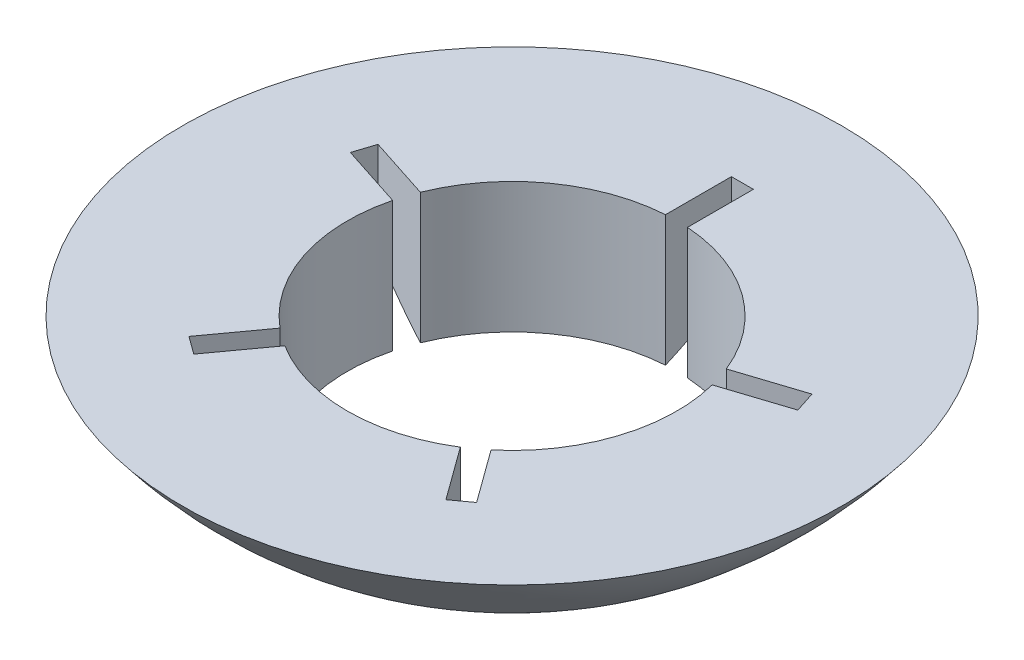
ISO-10303-21;
HEADER;
FILE_DESCRIPTION(('STEP AP214'),'2;1');
FILE_NAME('part.step','',(''),(''),'','','');
FILE_SCHEMA(('AUTOMOTIVE_DESIGN { 1 0 10303 214 1 1 1 1 }'));
ENDSEC;
DATA;
#1=APPLICATION_CONTEXT('core data for automotive mechanical design processes');
#2=APPLICATION_PROTOCOL_DEFINITION('international standard','automotive_design',2000,#1);
#3=PRODUCT_CONTEXT('',#1,'mechanical');
#4=PRODUCT('Part','Part','',(#3));
#5=PRODUCT_RELATED_PRODUCT_CATEGORY('part','',(#4));
#6=PRODUCT_DEFINITION_FORMATION('','',#4);
#7=PRODUCT_DEFINITION_CONTEXT('part definition',#1,'design');
#8=PRODUCT_DEFINITION('design','',#6,#7);
#9=PRODUCT_DEFINITION_SHAPE('','',#8);
#10=(LENGTH_UNIT() NAMED_UNIT(*) SI_UNIT(.MILLI.,.METRE.));
#11=(NAMED_UNIT(*) PLANE_ANGLE_UNIT() SI_UNIT($,.RADIAN.));
#12=(NAMED_UNIT(*) SI_UNIT($,.STERADIAN.) SOLID_ANGLE_UNIT());
#13=UNCERTAINTY_MEASURE_WITH_UNIT(LENGTH_MEASURE(1.E-05),#10,'distance_accuracy_value','');
#14=(GEOMETRIC_REPRESENTATION_CONTEXT(3) GLOBAL_UNCERTAINTY_ASSIGNED_CONTEXT((#13)) GLOBAL_UNIT_ASSIGNED_CONTEXT((#10,
#11,#12)) REPRESENTATION_CONTEXT('',''));
#15=CARTESIAN_POINT('',(0.,0.,0.));
#16=DIRECTION('',(0.,0.,1.));
#17=DIRECTION('',(1.,0.,0.));
#18=AXIS2_PLACEMENT_3D('',#15,#16,#17);
#19=CARTESIAN_POINT('',(0.,2.2498309057561,0.));
#20=DIRECTION('',(0.,-1.,0.));
#21=DIRECTION('',(0.,0.,-1.));
#22=AXIS2_PLACEMENT_3D('',#19,#20,#21);
#23=DEGENERATE_TOROIDAL_SURFACE('',#22,8.45471219482457E-05,3.74983090670924,.T.);
#24=CARTESIAN_POINT('',(0.,0.,0.));
#25=DIRECTION('',(0.,-1.,0.));
#26=DIRECTION('',(0.,0.,-1.));
#27=AXIS2_PLACEMENT_3D('',#24,#25,#26);
#28=CIRCLE('',#27,3.);
#29=CARTESIAN_POINT('',(0.,0.,-3.));
#30=VERTEX_POINT('',#29);
#31=EDGE_CURVE('E12',#30,#30,#28,.T.);
#32=ORIENTED_EDGE('',*,*,#31,.T.);
#33=EDGE_LOOP('',(#32));
#34=FACE_BOUND('',#33,.T.);
#35=CARTESIAN_POINT('',(1.30957287672877,-0.861991089667224,1.6319216845088));
#36=CARTESIAN_POINT('',(1.28253897691627,-0.863067253594937,1.65156296242041));
#37=CARTESIAN_POINT('',(1.25550507710377,-0.863605335558811,1.67120424033203));
#38=CARTESIAN_POINT('',(1.20143727747877,-0.863605335558885,1.71048679615526));
#39=CARTESIAN_POINT('',(1.17440337766627,-0.863067253595084,1.73012807406688));
#40=CARTESIAN_POINT('',(1.14736947785377,-0.861991089667446,1.74976935197849));
#41=B_SPLINE_CURVE_WITH_KNOTS('',3,(#35,#36,#37,#38,#39,#40),.UNSPECIFIED.,.F.,.F.,(4,2,4),(0.,
0.100260209572197,0.200520419144391),.UNSPECIFIED.);
#42=CARTESIAN_POINT('',(1.30937287672876,-0.861999043491411,1.6320669930144));
#43=VERTEX_POINT('',#42);
#44=CARTESIAN_POINT('',(1.14756947785377,-0.861999043492123,1.74962404347289));
#45=VERTEX_POINT('',#44);
#46=EDGE_CURVE('E753',#43,#45,#41,.T.);
#47=ORIENTED_EDGE('',*,*,#46,.F.);
#48=CARTESIAN_POINT('',(0.960472803362657,-1.18706090970247,1.15184723998223));
#49=CARTESIAN_POINT('',(1.02153028702982,-1.14181278266513,1.23588565661118));
#50=CARTESIAN_POINT('',(1.0811461440183,-1.09208639331853,1.31793984434351));
#51=CARTESIAN_POINT('',(1.19749460464242,-0.983677090002554,1.47807976202121));
#52=CARTESIAN_POINT('',(1.25422720827785,-0.924994176032481,1.55616549196627));
#53=CARTESIAN_POINT('',(1.30951818523436,-0.861832999752439,1.6322669930144));
#54=B_SPLINE_CURVE_WITH_KNOTS('',3,(#48,#49,#50,#51,#52,#53),.UNSPECIFIED.,.F.,.F.,(4,2,4),(0.,
0.338875914365437,0.6777518287573),.UNSPECIFIED.);
#55=CARTESIAN_POINT('',(0.960618111868258,-1.1869532688946,1.15204723998223));
#56=VERTEX_POINT('',#55);
#57=EDGE_CURVE('E816',#56,#43,#54,.T.);
#58=ORIENTED_EDGE('',*,*,#57,.F.);
#59=CARTESIAN_POINT('',(0.,-1.1869532688946,0.));
#60=DIRECTION('',(0.,1.,0.));
#61=DIRECTION('',(0.,0.,1.));
#62=AXIS2_PLACEMENT_3D('',#59,#60,#61);
#63=CIRCLE('',#62,1.5);
#64=CARTESIAN_POINT('',(1.4543127552116,-1.1869532688946,-0.367388636227162));
#65=VERTEX_POINT('',#64);
#66=EDGE_CURVE('E324',#56,#65,#63,.T.);
#67=ORIENTED_EDGE('',*,*,#66,.T.);
#68=CARTESIAN_POINT('',(1.45411275521144,-1.18704483497859,-0.367323652287862));
#69=CARTESIAN_POINT('',(1.55739544076853,-1.13973567759996,-0.40088223110519));
#70=CARTESIAN_POINT('',(1.6581110063415,-1.08754560223184,-0.433606702077087));
#71=CARTESIAN_POINT('',(1.85440789752769,-0.973403615511717,-0.497387428332766));
#72=CARTESIAN_POINT('',(1.94998922314046,-0.911451704158874,-0.528443683616404));
#73=CARTESIAN_POINT('',(2.04300342876867,-0.844618874815706,-0.558665831054467));
#74=B_SPLINE_CURVE_WITH_KNOTS('',3,(#68,#69,#70,#71,#72,#73),.UNSPECIFIED.,.F.,.F.,(4,2,4),(0.,
0.3541819885935,0.708363977217515),.UNSPECIFIED.);
#75=CARTESIAN_POINT('',(2.04280342876878,-0.844762633745063,-0.558600847115256));
#76=VERTEX_POINT('',#75);
#77=EDGE_CURVE('E732',#65,#76,#74,.T.);
#78=ORIENTED_EDGE('',*,*,#77,.T.);
#79=CARTESIAN_POINT('',(2.04286841270802,-0.844755831385263,-0.558400847115256));
#80=CARTESIAN_POINT('',(2.03254618491578,-0.84583718962296,-0.590169397658426));
#81=CARTESIAN_POINT('',(2.02222395712353,-0.846377868741829,-0.621937948201596));
#82=CARTESIAN_POINT('',(2.00157950153904,-0.846377868741912,-0.685475049287937));
#83=CARTESIAN_POINT('',(1.99125727374679,-0.845837189623125,-0.717243599831107));
#84=CARTESIAN_POINT('',(1.98093504595454,-0.84475583138551,-0.749012150374278));
#85=B_SPLINE_CURVE_WITH_KNOTS('',3,(#79,#80,#81,#82,#83,#84),.UNSPECIFIED.,.F.,.F.,(4,2,4),(0.,
0.100223419005077,0.200446838010149),.UNSPECIFIED.);
#86=CARTESIAN_POINT('',(1.98100002989379,-0.844762633745055,-0.748812150374287));
#87=VERTEX_POINT('',#86);
#88=EDGE_CURVE('E720',#76,#87,#85,.T.);
#89=ORIENTED_EDGE('',*,*,#88,.T.);
#90=CARTESIAN_POINT('',(1.39230935633645,-1.18704483497859,-0.557534955546893));
#91=CARTESIAN_POINT('',(1.49559204189354,-1.13973567759996,-0.591093534364221));
#92=CARTESIAN_POINT('',(1.59630760746651,-1.08754560223184,-0.623818005336118));
#93=CARTESIAN_POINT('',(1.7926044986527,-0.973403615511717,-0.687598731591796));
#94=CARTESIAN_POINT('',(1.88818582426547,-0.911451704158874,-0.718654986875435));
#95=CARTESIAN_POINT('',(1.98120002989368,-0.844618874815706,-0.748877134313498));
#96=B_SPLINE_CURVE_WITH_KNOTS('',3,(#90,#91,#92,#93,#94,#95),.UNSPECIFIED.,.F.,.F.,(4,2,4),(0.,
0.3541819885935,0.708363977217515),.UNSPECIFIED.);
#97=CARTESIAN_POINT('',(1.39250935633661,-1.1869532688946,-0.557599939486193));
#98=VERTEX_POINT('',#97);
#99=EDGE_CURVE('E413',#98,#87,#96,.T.);
#100=ORIENTED_EDGE('',*,*,#99,.F.);
#101=CARTESIAN_POINT('',(0.,-1.1869532688946,0.));
#102=DIRECTION('',(0.,1.,0.));
#103=DIRECTION('',(0.,0.,1.));
#104=AXIS2_PLACEMENT_3D('',#101,#102,#103);
#105=CIRCLE('',#104,1.5);
#106=CARTESIAN_POINT('',(0.100000000000002,-1.1869532688946,-1.49666295470958));
#107=VERTEX_POINT('',#106);
#108=EDGE_CURVE('E690',#98,#107,#105,.T.);
#109=ORIENTED_EDGE('',*,*,#108,.T.);
#110=CARTESIAN_POINT('',(0.0999999999999998,-1.4967777641158,0.119086487430774));
#111=CARTESIAN_POINT('',(0.0999999999999998,-1.49842707961132,0.0672494346066216));
#112=CARTESIAN_POINT('',(0.0999999999999998,-1.49899738857468,0.0153678219882223));
#113=CARTESIAN_POINT('',(0.0999999999999998,-1.49747454120774,-0.140631859985865));
#114=CARTESIAN_POINT('',(0.0999999999999999,-1.49212044629915,-0.244734582626762));
#115=CARTESIAN_POINT('',(0.1,-1.47276279872692,-0.452215681217369));
#116=CARTESIAN_POINT('',(0.1,-1.45874932227544,-0.555593088278416));
#117=CARTESIAN_POINT('',(0.100000000000001,-1.40345795378114,-0.865491243655203));
#118=CARTESIAN_POINT('',(0.100000000000001,-1.34894808586947,-1.06982068503745));
#119=CARTESIAN_POINT('',(0.100000000000002,-1.20634984417823,-1.46658051087196));
#120=CARTESIAN_POINT('',(0.100000000000003,-1.11821794862746,-1.65899509542113));
#121=CARTESIAN_POINT('',(0.100000000000004,-0.910932953686926,-2.02621588985694));
#122=CARTESIAN_POINT('',(0.100000000000005,-0.791796478520602,-2.20103146663441));
#123=CARTESIAN_POINT('',(0.100000000000007,-0.52588912503074,-2.52813305988174));
#124=CARTESIAN_POINT('',(0.100000000000008,-0.379124553449103,-2.68042420392653));
#125=CARTESIAN_POINT('',(0.10000000000001,-0.0620741880190709,-2.95825759573047));
#126=CARTESIAN_POINT('',(0.100000000000011,0.108220399201311,-3.08378979863583));
#127=CARTESIAN_POINT('',(0.100000000000014,0.467455850371269,-3.30443578747348));
#128=CARTESIAN_POINT('',(0.100000000000015,0.65638692523599,-3.39956543261885));
#129=CARTESIAN_POINT('',(0.100000000000017,0.974964440768628,-3.52763375492893));
#130=CARTESIAN_POINT('',(0.100000000000018,1.10069390636195,-3.5705611009153));
#131=CARTESIAN_POINT('',(0.10000000000002,1.35578505943016,-3.64281339116685));
#132=CARTESIAN_POINT('',(0.100000000000021,1.48514062632335,-3.67215994652106));
#133=CARTESIAN_POINT('',(0.100000000000022,1.61574944214035,-3.69456323229674));
#134=B_SPLINE_CURVE_WITH_KNOTS('',3,(#110,#111,#112,#113,#114,#115,#116,#117,#118,#119,#120,
#121,#122,#123,#124,#125,#126,#127,#128,#129,#130,#131,#132,#133),.UNSPECIFIED.,.F.,.F.,(4,2,2,
2,2,2,2,2,2,2,2,4),(0.,0.155604642323413,0.467923886660647,0.780601719288348,1.41175661512738,
2.04373129193219,2.67536780838398,3.30686031388195,3.93858945515233,4.56998852083999,
4.96786699623259,5.36511013251402),.UNSPECIFIED.);
#135=CARTESIAN_POINT('',(0.100000000000005,-0.857513814864103,-2.09666295470958));
#136=VERTEX_POINT('',#135);
#137=EDGE_CURVE('E129',#107,#136,#134,.T.);
#138=ORIENTED_EDGE('',*,*,#137,.T.);
#139=CARTESIAN_POINT('',(-1.61347459504216,-0.40768360334442,-2.09666295470958));
#140=CARTESIAN_POINT('',(-1.53872010323063,-0.4530781809679,-2.09666295470958));
#141=CARTESIAN_POINT('',(-1.46204511493374,-0.495301844852334,-2.09666295470958));
#142=CARTESIAN_POINT('',(-1.30541601203126,-0.57314222951147,-2.09666295470958));
#143=CARTESIAN_POINT('',(-1.22546205003097,-0.608759257337641,-2.09666295470958));
#144=CARTESIAN_POINT('',(-1.06291368963312,-0.673092326953327,-2.09666295470958));
#145=CARTESIAN_POINT('',(-0.98032209991037,-0.70181544919972,-2.09666295470958));
#146=CARTESIAN_POINT('',(-0.813039294254336,-0.752205834350359,-2.09666295470958));
#147=CARTESIAN_POINT('',(-0.728348109597827,-0.773873202293281,-2.09666295470958));
#148=CARTESIAN_POINT('',(-0.471939743359688,-0.828045933074776,-2.09666295470958));
#149=CARTESIAN_POINT('',(-0.297805086769668,-0.849754552358355,-2.09666295470958));
#150=CARTESIAN_POINT('',(0.0516056898639834,-0.86361442336343,-2.09666295470958));
#151=CARTESIAN_POINT('',(0.226882145443191,-0.855756555517895,-2.09666295470958));
#152=CARTESIAN_POINT('',(0.573746140767107,-0.810729800837129,-2.09666295470958));
#153=CARTESIAN_POINT('',(0.745330924265261,-0.773539744538418,-2.09666295470958));
#154=CARTESIAN_POINT('',(1.07963729078557,-0.67086969112344,-2.09666295470958));
#155=CARTESIAN_POINT('',(1.24237358016641,-0.60543835717946,-2.09666295470958));
#156=CARTESIAN_POINT('',(1.43492155460642,-0.508495283851088,-2.09666295470958));
#157=CARTESIAN_POINT('',(1.47121749851136,-0.489307553841017,-2.09666295470958));
#158=CARTESIAN_POINT('',(1.54296871174883,-0.449538987355308,-2.09666295470958));
#159=CARTESIAN_POINT('',(1.578425132184,-0.428960227858353,-2.09666295470958));
#160=CARTESIAN_POINT('',(1.6134745950427,-0.407683603345476,-2.09666295470958));
#161=B_SPLINE_CURVE_WITH_KNOTS('',3,(#139,#140,#141,#142,#143,#144,#145,#146,#147,#148,#149,
#150,#151,#152,#153,#154,#155,#156,#157,#158,#159,#160),.UNSPECIFIED.,.F.,.F.,(4,2,2,2,2,2,2,2,
2,2,4),(0.,0.262288697194732,0.524565201146307,0.786571167420966,1.04857323304699,
1.57231411558042,2.09621655540479,2.6204974495505,3.14387852783914,3.26702773766418,
3.38999696755904),.UNSPECIFIED.);
#162=CARTESIAN_POINT('',(-0.0999999999999956,-0.85751381487092,-2.09666295470958));
#163=VERTEX_POINT('',#162);
#164=EDGE_CURVE('E764',#163,#136,#161,.T.);
#165=ORIENTED_EDGE('',*,*,#164,.F.);
#166=CARTESIAN_POINT('',(-0.1,-1.4967777641158,0.119086487430774));
#167=CARTESIAN_POINT('',(-0.1,-1.49842707961132,0.0672494346066213));
#168=CARTESIAN_POINT('',(-0.1,-1.49899738857468,0.0153678219882222));
#169=CARTESIAN_POINT('',(-0.1,-1.49747454120774,-0.140631859985865));
#170=CARTESIAN_POINT('',(-0.1,-1.49212044629915,-0.24473458262676));
#171=CARTESIAN_POINT('',(-0.0999999999999999,-1.47276279872692,-0.452215681217367));
#172=CARTESIAN_POINT('',(-0.0999999999999998,-1.45874932227544,-0.555593088278413));
#173=CARTESIAN_POINT('',(-0.0999999999999994,-1.40345795378114,-0.865491243655199));
#174=CARTESIAN_POINT('',(-0.099999999999999,-1.34894808586947,-1.06982068503744));
#175=CARTESIAN_POINT('',(-0.099999999999998,-1.20634984417824,-1.46658051087196));
#176=CARTESIAN_POINT('',(-0.0999999999999974,-1.11821794862746,-1.65899509542113));
#177=CARTESIAN_POINT('',(-0.0999999999999959,-0.910932953686928,-2.02621588985694));
#178=CARTESIAN_POINT('',(-0.0999999999999951,-0.791796478520604,-2.20103146663441));
#179=CARTESIAN_POINT('',(-0.0999999999999932,-0.525889125030743,-2.52813305988173));
#180=CARTESIAN_POINT('',(-0.0999999999999921,-0.379124553449106,-2.68042420392653));
#181=CARTESIAN_POINT('',(-0.0999999999999899,-0.0620741880190744,-2.95825759573047));
#182=CARTESIAN_POINT('',(-0.0999999999999887,0.108220399201308,-3.08378979863582));
#183=CARTESIAN_POINT('',(-0.0999999999999862,0.467455850371265,-3.30443578747348));
#184=CARTESIAN_POINT('',(-0.0999999999999849,0.656386925235987,-3.39956543261885));
#185=CARTESIAN_POINT('',(-0.0999999999999826,0.974964440768625,-3.52763375492893));
#186=CARTESIAN_POINT('',(-0.0999999999999817,1.10069390636195,-3.5705611009153));
#187=CARTESIAN_POINT('',(-0.09999999999998,1.35578505943016,-3.64281339116685));
#188=CARTESIAN_POINT('',(-0.099999999999979,1.48514062632335,-3.67215994652106));
#189=CARTESIAN_POINT('',(-0.0999999999999781,1.61574944214035,-3.69456323229674));
#190=B_SPLINE_CURVE_WITH_KNOTS('',3,(#166,#167,#168,#169,#170,#171,#172,#173,#174,#175,#176,
#177,#178,#179,#180,#181,#182,#183,#184,#185,#186,#187,#188,#189),.UNSPECIFIED.,.F.,.F.,(4,2,2,
2,2,2,2,2,2,2,2,4),(0.,0.155604642323412,0.467923886660644,0.780601719288344,1.41175661512738,
2.04373129193218,2.67536780838398,3.30686031388195,3.93858945515233,4.56998852083999,
4.96786699623259,5.36511013251402),.UNSPECIFIED.);
#191=CARTESIAN_POINT('',(-0.099999999999998,-1.1869532688946,-1.49666295470958));
#192=VERTEX_POINT('',#191);
#193=EDGE_CURVE('E752',#192,#163,#190,.T.);
#194=ORIENTED_EDGE('',*,*,#193,.F.);
#195=CARTESIAN_POINT('',(0.,-1.1869532688946,0.));
#196=DIRECTION('',(0.,1.,0.));
#197=DIRECTION('',(0.,0.,1.));
#198=AXIS2_PLACEMENT_3D('',#195,#196,#197);
#199=CIRCLE('',#198,1.5);
#200=CARTESIAN_POINT('',(-1.3925093563366,-1.1869532688946,-0.557599939486213));
#201=VERTEX_POINT('',#200);
#202=EDGE_CURVE('E268',#192,#201,#199,.T.);
#203=ORIENTED_EDGE('',*,*,#202,.T.);
#204=CARTESIAN_POINT('',(-1.96313460897193,-0.857519956563052,-0.743007323235318));
#205=CARTESIAN_POINT('',(-1.87277754514966,-0.921596092574833,-0.713648533505689));
#206=CARTESIAN_POINT('',(-1.78003024218358,-0.981094567116268,-0.683513107999525));
#207=CARTESIAN_POINT('',(-1.58975515797136,-1.09093619325405,-0.6216889854366));
#208=CARTESIAN_POINT('',(-1.49222737672562,-1.14127934485113,-0.590000288379963));
#209=CARTESIAN_POINT('',(-1.39230935633644,-1.18704483497859,-0.557534955546916));
#210=B_SPLINE_CURVE_WITH_KNOTS('',3,(#204,#205,#206,#207,#208,#209),.UNSPECIFIED.,.F.,.F.,(4,2,
4),(0.,0.34271339477194,0.685426789516466),.UNSPECIFIED.);
#211=CARTESIAN_POINT('',(-1.96293460897198,-0.857661833225101,-0.742942339296088));
#212=VERTEX_POINT('',#211);
#213=EDGE_CURVE('E419',#212,#201,#210,.T.);
#214=ORIENTED_EDGE('',*,*,#213,.F.);
#215=CARTESIAN_POINT('',(-2.02480299178622,-0.85765505909182,-0.552531036037058));
#216=CARTESIAN_POINT('',(-2.01448076399397,-0.858731930540597,-0.584299586580228));
#217=CARTESIAN_POINT('',(-2.00415853620173,-0.859270366265004,-0.616068137123399));
#218=CARTESIAN_POINT('',(-1.98351408061723,-0.85927036626508,-0.67960523820974));
#219=CARTESIAN_POINT('',(-1.97319185282498,-0.858731930540748,-0.71137378875291));
#220=CARTESIAN_POINT('',(-1.96286962503274,-0.857655059092047,-0.743142339296081));
#221=B_SPLINE_CURVE_WITH_KNOTS('',3,(#215,#216,#217,#218,#219,#220),.UNSPECIFIED.,.F.,.F.,(4,2,
4),(0.,0.100223310308256,0.200446620616509),.UNSPECIFIED.);
#222=CARTESIAN_POINT('',(-2.02473800784697,-0.857661833225101,-0.552731036037058));
#223=VERTEX_POINT('',#222);
#224=EDGE_CURVE('E712',#223,#212,#221,.T.);
#225=ORIENTED_EDGE('',*,*,#224,.F.);
#226=CARTESIAN_POINT('',(-2.02493800784692,-0.857519956563051,-0.552796019976288));
#227=CARTESIAN_POINT('',(-1.93458094402466,-0.921596092574833,-0.523437230246659));
#228=CARTESIAN_POINT('',(-1.84183364105857,-0.981094567116267,-0.493301804740495));
#229=CARTESIAN_POINT('',(-1.65155855684636,-1.09093619325405,-0.43147768217757));
#230=CARTESIAN_POINT('',(-1.55403077560062,-1.14127934485113,-0.399788985120933));
#231=CARTESIAN_POINT('',(-1.45411275521144,-1.18704483497859,-0.367323652287886));
#232=B_SPLINE_CURVE_WITH_KNOTS('',3,(#226,#227,#228,#229,#230,#231),.UNSPECIFIED.,.F.,.F.,(4,2,
4),(0.,0.34271339477194,0.685426789516466),.UNSPECIFIED.);
#233=CARTESIAN_POINT('',(-1.45431275521159,-1.1869532688946,-0.367388636227183));
#234=VERTEX_POINT('',#233);
#235=EDGE_CURVE('E684',#223,#234,#232,.T.);
#236=ORIENTED_EDGE('',*,*,#235,.T.);
#237=CARTESIAN_POINT('',(0.,-1.1869532688946,0.));
#238=DIRECTION('',(0.,1.,0.));
#239=DIRECTION('',(0.,0.,1.));
#240=AXIS2_PLACEMENT_3D('',#237,#238,#239);
#241=CIRCLE('',#240,1.5);
#242=CARTESIAN_POINT('',(-0.960618111868268,-1.1869532688946,1.15204723998222));
#243=VERTEX_POINT('',#242);
#244=EDGE_CURVE('E679',#234,#243,#241,.T.);
#245=ORIENTED_EDGE('',*,*,#244,.T.);
#246=CARTESIAN_POINT('',(-1.30951818523437,-0.861832999752443,1.63226699301438));
#247=CARTESIAN_POINT('',(-1.25422720827786,-0.924994176032485,1.55616549196625));
#248=CARTESIAN_POINT('',(-1.19749460464244,-0.983677090002557,1.4780797620212));
#249=CARTESIAN_POINT('',(-1.08114614401831,-1.09208639331853,1.3179398443435));
#250=CARTESIAN_POINT('',(-1.02153028702983,-1.14181278266514,1.23588565661116));
#251=CARTESIAN_POINT('',(-0.960472803362668,-1.18706090970247,1.15184723998221));
#252=B_SPLINE_CURVE_WITH_KNOTS('',3,(#246,#247,#248,#249,#250,#251),.UNSPECIFIED.,.F.,.F.,(4,2,
4),(0.,0.33887591439186,0.677751828757295),.UNSPECIFIED.);
#253=CARTESIAN_POINT('',(-1.30937287672877,-0.861999043491426,1.63206699301438));
#254=VERTEX_POINT('',#253);
#255=EDGE_CURVE('E417',#254,#243,#252,.T.);
#256=ORIENTED_EDGE('',*,*,#255,.F.);
#257=CARTESIAN_POINT('',(-1.14736947785378,-0.861991089667228,1.74976935197848));
#258=CARTESIAN_POINT('',(-1.17440337766628,-0.86306725359494,1.73012807406687));
#259=CARTESIAN_POINT('',(-1.20143727747878,-0.863605335558815,1.71048679615525));
#260=CARTESIAN_POINT('',(-1.25550507710377,-0.863605335558889,1.67120424033202));
#261=CARTESIAN_POINT('',(-1.28253897691627,-0.863067253595088,1.6515629624204));
#262=CARTESIAN_POINT('',(-1.30957287672877,-0.86199108966745,1.63192168450878));
#263=B_SPLINE_CURVE_WITH_KNOTS('',3,(#257,#258,#259,#260,#261,#262),.UNSPECIFIED.,.F.,.F.,(4,2,
4),(0.,0.100260209572197,0.20052041914439),.UNSPECIFIED.);
#264=CARTESIAN_POINT('',(-1.14756947785378,-0.861999043497013,1.74962404347288));
#265=VERTEX_POINT('',#264);
#266=EDGE_CURVE('E411',#265,#254,#263,.T.);
#267=ORIENTED_EDGE('',*,*,#266,.F.);
#268=CARTESIAN_POINT('',(-1.14771478635939,-0.861832999752443,1.74982404347288));
#269=CARTESIAN_POINT('',(-1.09242380940287,-0.924994176032485,1.67372254242474));
#270=CARTESIAN_POINT('',(-1.03569120576745,-0.983677090002557,1.59563681247969));
#271=CARTESIAN_POINT('',(-0.919342745143323,-1.09208639331853,1.43549689480199));
#272=CARTESIAN_POINT('',(-0.859726888154844,-1.14181278266514,1.35344270706966));
#273=CARTESIAN_POINT('',(-0.79866940448768,-1.18706090970247,1.26940429044071));
#274=B_SPLINE_CURVE_WITH_KNOTS('',3,(#268,#269,#270,#271,#272,#273),.UNSPECIFIED.,.F.,.F.,(4,2,
4),(0.,0.33887591439186,0.677751828757295),.UNSPECIFIED.);
#275=CARTESIAN_POINT('',(-0.798814712993281,-1.1869532688946,1.26960429044071));
#276=VERTEX_POINT('',#275);
#277=EDGE_CURVE('E402',#265,#276,#274,.T.);
#278=ORIENTED_EDGE('',*,*,#277,.T.);
#279=CARTESIAN_POINT('',(0.,-1.1869532688946,0.));
#280=DIRECTION('',(0.,1.,0.));
#281=DIRECTION('',(0.,0.,1.));
#282=AXIS2_PLACEMENT_3D('',#279,#280,#281);
#283=CIRCLE('',#282,1.5);
#284=CARTESIAN_POINT('',(0.798814712993267,-1.1869532688946,1.26960429044072));
#285=VERTEX_POINT('',#284);
#286=EDGE_CURVE('E409',#276,#285,#283,.T.);
#287=ORIENTED_EDGE('',*,*,#286,.T.);
#288=CARTESIAN_POINT('',(0.798669404487666,-1.18706090970247,1.26940429044072));
#289=CARTESIAN_POINT('',(0.859726888154829,-1.14181278266514,1.35344270706967));
#290=CARTESIAN_POINT('',(0.919342745143308,-1.09208639331853,1.43549689480201));
#291=CARTESIAN_POINT('',(1.03569120576743,-0.983677090002554,1.59563681247971));
#292=CARTESIAN_POINT('',(1.09242380940286,-0.924994176032482,1.67372254242476));
#293=CARTESIAN_POINT('',(1.14771478635937,-0.861832999752439,1.74982404347289));
#294=B_SPLINE_CURVE_WITH_KNOTS('',3,(#288,#289,#290,#291,#292,#293),.UNSPECIFIED.,.F.,.F.,(4,2,
4),(0.,0.338875914365437,0.677751828757299),.UNSPECIFIED.);
#295=EDGE_CURVE('E744',#285,#45,#294,.T.);
#296=ORIENTED_EDGE('',*,*,#295,.T.);
#297=EDGE_LOOP('',(#47,#58,#67,#78,#89,#100,#109,#138,#165,#194,#203,#214,#225,#236,#245,#256,
#267,#278,#287,#296));
#298=FACE_BOUND('',#297,.T.);
#299=ADVANCED_FACE('F120',(#34,#298),#23,.T.);
#300=CARTESIAN_POINT('',(0.,0.,0.));
#301=DIRECTION('',(0.,-1.,0.));
#302=DIRECTION('',(0.,0.,-1.));
#303=AXIS2_PLACEMENT_3D('',#300,#301,#302);
#304=PLANE('',#303);
#305=ORIENTED_EDGE('',*,*,#31,.F.);
#306=EDGE_LOOP('',(#305));
#307=FACE_BOUND('',#306,.T.);
#308=DIRECTION('',(0.809016994374951,0.,-0.587785252292468));
#309=VECTOR('',#308,1.);
#310=CARTESIAN_POINT('',(1.22847117729126,0.,1.69084551824365));
#311=LINE('',#310,#309);
#312=CARTESIAN_POINT('',(1.14756947785378,0.,1.74962404347289));
#313=VERTEX_POINT('',#312);
#314=CARTESIAN_POINT('',(1.30937287672877,0.,1.6320669930144));
#315=VERTEX_POINT('',#314);
#316=EDGE_CURVE('E335',#313,#315,#311,.T.);
#317=ORIENTED_EDGE('',*,*,#316,.F.);
#318=DIRECTION('',(-0.587785252292468,0.,-0.809016994374951));
#319=VECTOR('',#318,1.);
#320=CARTESIAN_POINT('',(-0.0809016994374879,0.,0.0587785252292416));
#321=LINE('',#320,#319);
#322=CARTESIAN_POINT('',(0.798814712993276,0.,1.26960429044072));
#323=VERTEX_POINT('',#322);
#324=EDGE_CURVE('E329',#313,#323,#321,.T.);
#325=ORIENTED_EDGE('',*,*,#324,.T.);
#326=CARTESIAN_POINT('',(0.,0.,0.));
#327=DIRECTION('',(0.,-1.,0.));
#328=DIRECTION('',(1.,0.,0.));
#329=AXIS2_PLACEMENT_3D('',#326,#327,#328);
#330=CIRCLE('',#329,1.5);
#331=CARTESIAN_POINT('',(-0.798814712993273,0.,1.26960429044071));
#332=VERTEX_POINT('',#331);
#333=EDGE_CURVE('E294',#323,#332,#330,.T.);
#334=ORIENTED_EDGE('',*,*,#333,.T.);
#335=DIRECTION('',(-0.58778525229248,0.,0.809016994374943));
#336=VECTOR('',#335,1.);
#337=CARTESIAN_POINT('',(0.0809016994375009,0.,0.0587785252292528));
#338=LINE('',#337,#336);
#339=CARTESIAN_POINT('',(-1.14756947785378,0.,1.74962404347288));
#340=VERTEX_POINT('',#339);
#341=EDGE_CURVE('E298',#332,#340,#338,.T.);
#342=ORIENTED_EDGE('',*,*,#341,.T.);
#343=DIRECTION('',(0.809016994374943,0.,0.587785252292479));
#344=VECTOR('',#343,1.);
#345=CARTESIAN_POINT('',(-1.22847117729128,0.,1.69084551824363));
#346=LINE('',#345,#344);
#347=CARTESIAN_POINT('',(-1.30937287672877,0.,1.63206699301438));
#348=VERTEX_POINT('',#347);
#349=EDGE_CURVE('E379',#348,#340,#346,.T.);
#350=ORIENTED_EDGE('',*,*,#349,.F.);
#351=DIRECTION('',(-0.58778525229248,0.,0.809016994374943));
#352=VECTOR('',#351,1.);
#353=CARTESIAN_POINT('',(-0.0809016994374879,0.,-0.0587785252292433));
#354=LINE('',#353,#352);
#355=CARTESIAN_POINT('',(-0.960618111868261,0.,1.15204723998221));
#356=VERTEX_POINT('',#355);
#357=EDGE_CURVE('E382',#356,#348,#354,.T.);
#358=ORIENTED_EDGE('',*,*,#357,.F.);
#359=CARTESIAN_POINT('',(-1.45431275521158,0.,-0.367388636227183));
#360=VERTEX_POINT('',#359);
#361=EDGE_CURVE('E291',#356,#360,#330,.T.);
#362=ORIENTED_EDGE('',*,*,#361,.T.);
#363=DIRECTION('',(-0.95105651629515,0.,-0.309016994374958));
#364=VECTOR('',#363,1.);
#365=CARTESIAN_POINT('',(-0.0309016994374949,0.,0.0951056516295121));
#366=LINE('',#365,#364);
#367=CARTESIAN_POINT('',(-2.02473800784697,0.,-0.552731036037058));
#368=VERTEX_POINT('',#367);
#369=EDGE_CURVE('E144',#360,#368,#366,.T.);
#370=ORIENTED_EDGE('',*,*,#369,.T.);
#371=DIRECTION('',(-0.309016994374958,0.,0.95105651629515));
#372=VECTOR('',#371,1.);
#373=CARTESIAN_POINT('',(-1.99383630840947,0.,-0.64783668766657));
#374=LINE('',#373,#372);
#375=CARTESIAN_POINT('',(-1.96293460897197,0.,-0.742942339296088));
#376=VERTEX_POINT('',#375);
#377=EDGE_CURVE('E362',#376,#368,#374,.T.);
#378=ORIENTED_EDGE('',*,*,#377,.F.);
#379=DIRECTION('',(-0.95105651629515,0.,-0.309016994374958));
#380=VECTOR('',#379,1.);
#381=CARTESIAN_POINT('',(0.0309016994374968,0.,-0.0951056516295179));
#382=LINE('',#381,#380);
#383=CARTESIAN_POINT('',(-1.39250935633659,0.,-0.557599939486213));
#384=VERTEX_POINT('',#383);
#385=EDGE_CURVE('E289',#384,#376,#382,.T.);
#386=ORIENTED_EDGE('',*,*,#385,.F.);
#387=CARTESIAN_POINT('',(-0.0999999999999897,0.,-1.49666295470958));
#388=VERTEX_POINT('',#387);
#389=EDGE_CURVE('E265',#384,#388,#330,.T.);
#390=ORIENTED_EDGE('',*,*,#389,.T.);
#391=DIRECTION('',(0.,0.,1.));
#392=VECTOR('',#391,1.);
#393=CARTESIAN_POINT('',(-0.0999999999999897,0.,0.));
#394=LINE('',#393,#392);
#395=CARTESIAN_POINT('',(-0.0999999999999896,0.,-2.09666295470958));
#396=VERTEX_POINT('',#395);
#397=EDGE_CURVE('E277',#396,#388,#394,.T.);
#398=ORIENTED_EDGE('',*,*,#397,.F.);
#399=DIRECTION('',(-1.,0.,0.));
#400=VECTOR('',#399,1.);
#401=CARTESIAN_POINT('',(0.,0.,-2.09666295470958));
#402=LINE('',#401,#400);
#403=CARTESIAN_POINT('',(0.100000000000011,0.,-2.09666295470958));
#404=VERTEX_POINT('',#403);
#405=EDGE_CURVE('E283',#404,#396,#402,.T.);
#406=ORIENTED_EDGE('',*,*,#405,.F.);
#407=DIRECTION('',(0.,0.,1.));
#408=VECTOR('',#407,1.);
#409=CARTESIAN_POINT('',(0.10000000000001,0.,0.));
#410=LINE('',#409,#408);
#411=CARTESIAN_POINT('',(0.10000000000001,0.,-1.49666295470958));
#412=VERTEX_POINT('',#411);
#413=EDGE_CURVE('E273',#404,#412,#410,.T.);
#414=ORIENTED_EDGE('',*,*,#413,.T.);
#415=CARTESIAN_POINT('',(1.39250935633662,0.,-0.557599939486193));
#416=VERTEX_POINT('',#415);
#417=EDGE_CURVE('E292',#412,#416,#330,.T.);
#418=ORIENTED_EDGE('',*,*,#417,.T.);
#419=DIRECTION('',(-0.951056516295155,0.,0.309016994374945));
#420=VECTOR('',#419,1.);
#421=CARTESIAN_POINT('',(-0.0309016994374935,0.,-0.0951056516295124));
#422=LINE('',#421,#420);
#423=CARTESIAN_POINT('',(1.98100002989379,0.,-0.748812150374287));
#424=VERTEX_POINT('',#423);
#425=EDGE_CURVE('E353',#424,#416,#422,.T.);
#426=ORIENTED_EDGE('',*,*,#425,.F.);
#427=DIRECTION('',(0.309016994374945,0.,0.951056516295155));
#428=VECTOR('',#427,1.);
#429=CARTESIAN_POINT('',(2.01190172933129,0.,-0.653706498744775));
#430=LINE('',#429,#428);
#431=CARTESIAN_POINT('',(2.04280342876878,0.,-0.558600847115256));
#432=VERTEX_POINT('',#431);
#433=EDGE_CURVE('E792',#424,#432,#430,.T.);
#434=ORIENTED_EDGE('',*,*,#433,.T.);
#435=DIRECTION('',(-0.951056516295155,0.,0.309016994374944));
#436=VECTOR('',#435,1.);
#437=CARTESIAN_POINT('',(0.0309016994374953,0.,0.0951056516295182));
#438=LINE('',#437,#436);
#439=CARTESIAN_POINT('',(1.45431275521161,0.,-0.367388636227162));
#440=VERTEX_POINT('',#439);
#441=EDGE_CURVE('E317',#432,#440,#438,.T.);
#442=ORIENTED_EDGE('',*,*,#441,.T.);
#443=CARTESIAN_POINT('',(0.960618111868266,0.,1.15204723998223));
#444=VERTEX_POINT('',#443);
#445=EDGE_CURVE('E300',#440,#444,#330,.T.);
#446=ORIENTED_EDGE('',*,*,#445,.T.);
#447=DIRECTION('',(-0.587785252292469,0.,-0.809016994374951));
#448=VECTOR('',#447,1.);
#449=CARTESIAN_POINT('',(0.0809016994375021,0.,-0.058778525229252));
#450=LINE('',#449,#448);
#451=EDGE_CURVE('E314',#315,#444,#450,.T.);
#452=ORIENTED_EDGE('',*,*,#451,.F.);
#453=EDGE_LOOP('',(#317,#325,#334,#342,#350,#358,#362,#370,#378,#386,#390,#398,#406,#414,#418,
#426,#434,#442,#446,#452));
#454=FACE_BOUND('',#453,.T.);
#455=ADVANCED_FACE('F287',(#307,#454),#304,.F.);
#456=CARTESIAN_POINT('',(0.10000000000001,0.,0.));
#457=DIRECTION('',(1.,0.,0.));
#458=DIRECTION('',(0.,1.,0.));
#459=AXIS2_PLACEMENT_3D('',#456,#457,#458);
#460=PLANE('',#459);
#461=DIRECTION('',(0.,-1.,0.));
#462=VECTOR('',#461,1.);
#463=CARTESIAN_POINT('',(0.10000000000001,0.,-1.49666295470958));
#464=LINE('',#463,#462);
#465=EDGE_CURVE('E687',#412,#107,#464,.T.);
#466=ORIENTED_EDGE('',*,*,#465,.F.);
#467=ORIENTED_EDGE('',*,*,#413,.F.);
#468=DIRECTION('',(0.,-1.,0.));
#469=VECTOR('',#468,1.);
#470=CARTESIAN_POINT('',(0.100000000000011,0.,-2.09666295470958));
#471=LINE('',#470,#469);
#472=EDGE_CURVE('E693',#404,#136,#471,.T.);
#473=ORIENTED_EDGE('',*,*,#472,.T.);
#474=ORIENTED_EDGE('',*,*,#137,.F.);
#475=EDGE_LOOP('',(#466,#467,#473,#474));
#476=FACE_BOUND('',#475,.T.);
#477=ADVANCED_FACE('F450',(#476),#460,.F.);
#478=CARTESIAN_POINT('',(0.,0.,-2.09666295470958));
#479=DIRECTION('',(0.,0.,1.));
#480=DIRECTION('',(1.,0.,0.));
#481=AXIS2_PLACEMENT_3D('',#478,#479,#480);
#482=PLANE('',#481);
#483=ORIENTED_EDGE('',*,*,#164,.T.);
#484=ORIENTED_EDGE('',*,*,#472,.F.);
#485=ORIENTED_EDGE('',*,*,#405,.T.);
#486=DIRECTION('',(0.,-1.,0.));
#487=VECTOR('',#486,1.);
#488=CARTESIAN_POINT('',(-0.0999999999999896,0.,-2.09666295470958));
#489=LINE('',#488,#487);
#490=EDGE_CURVE('E272',#396,#163,#489,.T.);
#491=ORIENTED_EDGE('',*,*,#490,.T.);
#492=EDGE_LOOP('',(#483,#484,#485,#491));
#493=FACE_BOUND('',#492,.T.);
#494=ADVANCED_FACE('F456',(#493),#482,.T.);
#495=CARTESIAN_POINT('',(-0.0999999999999897,0.,0.));
#496=DIRECTION('',(1.,0.,0.));
#497=DIRECTION('',(0.,1.,0.));
#498=AXIS2_PLACEMENT_3D('',#495,#496,#497);
#499=PLANE('',#498);
#500=ORIENTED_EDGE('',*,*,#193,.T.);
#501=ORIENTED_EDGE('',*,*,#490,.F.);
#502=ORIENTED_EDGE('',*,*,#397,.T.);
#503=DIRECTION('',(0.,-1.,0.));
#504=VECTOR('',#503,1.);
#505=CARTESIAN_POINT('',(-0.0999999999999897,0.,-1.49666295470958));
#506=LINE('',#505,#504);
#507=EDGE_CURVE('E260',#388,#192,#506,.T.);
#508=ORIENTED_EDGE('',*,*,#507,.T.);
#509=EDGE_LOOP('',(#500,#501,#502,#508));
#510=FACE_BOUND('',#509,.T.);
#511=ADVANCED_FACE('F278',(#510),#499,.T.);
#512=CARTESIAN_POINT('',(-0.0809016994374879,0.,0.0587785252292416));
#513=DIRECTION('',(-0.809016994374951,0.,0.587785252292468));
#514=DIRECTION('',(0.587785252292468,0.,0.809016994374951));
#515=AXIS2_PLACEMENT_3D('',#512,#513,#514);
#516=PLANE('',#515);
#517=DIRECTION('',(0.,-1.,0.));
#518=VECTOR('',#517,1.);
#519=CARTESIAN_POINT('',(0.798814712993276,0.,1.26960429044072));
#520=LINE('',#519,#518);
#521=EDGE_CURVE('E349',#323,#285,#520,.T.);
#522=ORIENTED_EDGE('',*,*,#521,.F.);
#523=ORIENTED_EDGE('',*,*,#324,.F.);
#524=DIRECTION('',(0.,-1.,0.));
#525=VECTOR('',#524,1.);
#526=CARTESIAN_POINT('',(1.14756947785378,0.,1.74962404347289));
#527=LINE('',#526,#525);
#528=EDGE_CURVE('E354',#313,#45,#527,.T.);
#529=ORIENTED_EDGE('',*,*,#528,.T.);
#530=ORIENTED_EDGE('',*,*,#295,.F.);
#531=EDGE_LOOP('',(#522,#523,#529,#530));
#532=FACE_BOUND('',#531,.T.);
#533=ADVANCED_FACE('F493',(#532),#516,.F.);
#534=CARTESIAN_POINT('',(1.22847117729126,0.,1.69084551824365));
#535=DIRECTION('',(-0.587785252292468,0.,-0.809016994374951));
#536=DIRECTION('',(-0.809016994374951,0.,0.587785252292468));
#537=AXIS2_PLACEMENT_3D('',#534,#535,#536);
#538=PLANE('',#537);
#539=ORIENTED_EDGE('',*,*,#46,.T.);
#540=ORIENTED_EDGE('',*,*,#528,.F.);
#541=ORIENTED_EDGE('',*,*,#316,.T.);
#542=DIRECTION('',(0.,-1.,0.));
#543=VECTOR('',#542,1.);
#544=CARTESIAN_POINT('',(1.30937287672877,0.,1.6320669930144));
#545=LINE('',#544,#543);
#546=EDGE_CURVE('E328',#315,#43,#545,.T.);
#547=ORIENTED_EDGE('',*,*,#546,.T.);
#548=EDGE_LOOP('',(#539,#540,#541,#547));
#549=FACE_BOUND('',#548,.T.);
#550=ADVANCED_FACE('F503',(#549),#538,.T.);
#551=CARTESIAN_POINT('',(0.0809016994375021,0.,-0.058778525229252));
#552=DIRECTION('',(-0.809016994374951,0.,0.587785252292469));
#553=DIRECTION('',(0.587785252292469,0.,0.809016994374951));
#554=AXIS2_PLACEMENT_3D('',#551,#552,#553);
#555=PLANE('',#554);
#556=ORIENTED_EDGE('',*,*,#57,.T.);
#557=ORIENTED_EDGE('',*,*,#546,.F.);
#558=ORIENTED_EDGE('',*,*,#451,.T.);
#559=DIRECTION('',(0.,-1.,0.));
#560=VECTOR('',#559,1.);
#561=CARTESIAN_POINT('',(0.960618111868266,0.,1.15204723998223));
#562=LINE('',#561,#560);
#563=EDGE_CURVE('E323',#444,#56,#562,.T.);
#564=ORIENTED_EDGE('',*,*,#563,.T.);
#565=EDGE_LOOP('',(#556,#557,#558,#564));
#566=FACE_BOUND('',#565,.T.);
#567=ADVANCED_FACE('F332',(#566),#555,.T.);
#568=CARTESIAN_POINT('',(0.0309016994374953,0.,0.0951056516295182));
#569=DIRECTION('',(0.309016994374944,0.,0.951056516295155));
#570=DIRECTION('',(0.951056516295155,0.,-0.309016994374944));
#571=AXIS2_PLACEMENT_3D('',#568,#569,#570);
#572=PLANE('',#571);
#573=DIRECTION('',(0.,-1.,0.));
#574=VECTOR('',#573,1.);
#575=CARTESIAN_POINT('',(1.45431275521161,0.,-0.367388636227162));
#576=LINE('',#575,#574);
#577=EDGE_CURVE('E284',#440,#65,#576,.T.);
#578=ORIENTED_EDGE('',*,*,#577,.F.);
#579=ORIENTED_EDGE('',*,*,#441,.F.);
#580=DIRECTION('',(0.,-1.,0.));
#581=VECTOR('',#580,1.);
#582=CARTESIAN_POINT('',(2.04280342876878,0.,-0.558600847115256));
#583=LINE('',#582,#581);
#584=EDGE_CURVE('E799',#432,#76,#583,.T.);
#585=ORIENTED_EDGE('',*,*,#584,.T.);
#586=ORIENTED_EDGE('',*,*,#77,.F.);
#587=EDGE_LOOP('',(#578,#579,#585,#586));
#588=FACE_BOUND('',#587,.T.);
#589=ADVANCED_FACE('F524',(#588),#572,.F.);
#590=CARTESIAN_POINT('',(2.01190172933129,0.,-0.653706498744775));
#591=DIRECTION('',(0.951056516295154,0.,-0.309016994374945));
#592=DIRECTION('',(-0.309016994374945,0.,-0.951056516295155));
#593=AXIS2_PLACEMENT_3D('',#590,#591,#592);
#594=PLANE('',#593);
#595=ORIENTED_EDGE('',*,*,#584,.F.);
#596=ORIENTED_EDGE('',*,*,#433,.F.);
#597=DIRECTION('',(0.,-1.,0.));
#598=VECTOR('',#597,1.);
#599=CARTESIAN_POINT('',(1.98100002989379,0.,-0.748812150374287));
#600=LINE('',#599,#598);
#601=EDGE_CURVE('E802',#424,#87,#600,.T.);
#602=ORIENTED_EDGE('',*,*,#601,.T.);
#603=ORIENTED_EDGE('',*,*,#88,.F.);
#604=EDGE_LOOP('',(#595,#596,#602,#603));
#605=FACE_BOUND('',#604,.T.);
#606=ADVANCED_FACE('F534',(#605),#594,.F.);
#607=CARTESIAN_POINT('',(-1.99383630840947,0.,-0.64783668766657));
#608=DIRECTION('',(0.95105651629515,0.,0.309016994374958));
#609=DIRECTION('',(0.309016994374958,0.,-0.95105651629515));
#610=AXIS2_PLACEMENT_3D('',#607,#608,#609);
#611=PLANE('',#610);
#612=ORIENTED_EDGE('',*,*,#224,.T.);
#613=DIRECTION('',(0.,-1.,0.));
#614=VECTOR('',#613,1.);
#615=CARTESIAN_POINT('',(-1.96293460897197,0.,-0.742942339296088));
#616=LINE('',#615,#614);
#617=EDGE_CURVE('E341',#376,#212,#616,.T.);
#618=ORIENTED_EDGE('',*,*,#617,.F.);
#619=ORIENTED_EDGE('',*,*,#377,.T.);
#620=DIRECTION('',(0.,-1.,0.));
#621=VECTOR('',#620,1.);
#622=CARTESIAN_POINT('',(-2.02473800784697,0.,-0.552731036037058));
#623=LINE('',#622,#621);
#624=EDGE_CURVE('E371',#368,#223,#623,.T.);
#625=ORIENTED_EDGE('',*,*,#624,.T.);
#626=EDGE_LOOP('',(#612,#618,#619,#625));
#627=FACE_BOUND('',#626,.T.);
#628=ADVANCED_FACE('F545',(#627),#611,.T.);
#629=CARTESIAN_POINT('',(-0.0309016994374949,0.,0.0951056516295121));
#630=DIRECTION('',(-0.309016994374958,0.,0.95105651629515));
#631=DIRECTION('',(0.95105651629515,0.,0.309016994374958));
#632=AXIS2_PLACEMENT_3D('',#629,#630,#631);
#633=PLANE('',#632);
#634=ORIENTED_EDGE('',*,*,#624,.F.);
#635=ORIENTED_EDGE('',*,*,#369,.F.);
#636=DIRECTION('',(0.,-1.,0.));
#637=VECTOR('',#636,1.);
#638=CARTESIAN_POINT('',(-1.45431275521158,0.,-0.367388636227183));
#639=LINE('',#638,#637);
#640=EDGE_CURVE('E366',#360,#234,#639,.T.);
#641=ORIENTED_EDGE('',*,*,#640,.T.);
#642=ORIENTED_EDGE('',*,*,#235,.F.);
#643=EDGE_LOOP('',(#634,#635,#641,#642));
#644=FACE_BOUND('',#643,.T.);
#645=ADVANCED_FACE('F556',(#644),#633,.F.);
#646=CARTESIAN_POINT('',(-0.0809016994374879,0.,-0.0587785252292433));
#647=DIRECTION('',(0.809016994374943,0.,0.58778525229248));
#648=DIRECTION('',(0.58778525229248,0.,-0.809016994374943));
#649=AXIS2_PLACEMENT_3D('',#646,#647,#648);
#650=PLANE('',#649);
#651=ORIENTED_EDGE('',*,*,#255,.T.);
#652=DIRECTION('',(0.,-1.,0.));
#653=VECTOR('',#652,1.);
#654=CARTESIAN_POINT('',(-0.960618111868261,0.,1.15204723998221));
#655=LINE('',#654,#653);
#656=EDGE_CURVE('E136',#356,#243,#655,.T.);
#657=ORIENTED_EDGE('',*,*,#656,.F.);
#658=ORIENTED_EDGE('',*,*,#357,.T.);
#659=DIRECTION('',(0.,-1.,0.));
#660=VECTOR('',#659,1.);
#661=CARTESIAN_POINT('',(-1.30937287672877,0.,1.63206699301438));
#662=LINE('',#661,#660);
#663=EDGE_CURVE('E388',#348,#254,#662,.T.);
#664=ORIENTED_EDGE('',*,*,#663,.T.);
#665=EDGE_LOOP('',(#651,#657,#658,#664));
#666=FACE_BOUND('',#665,.T.);
#667=ADVANCED_FACE('F567',(#666),#650,.T.);
#668=CARTESIAN_POINT('',(-1.22847117729128,0.,1.69084551824363));
#669=DIRECTION('',(0.587785252292479,0.,-0.809016994374943));
#670=DIRECTION('',(-0.809016994374943,0.,-0.587785252292479));
#671=AXIS2_PLACEMENT_3D('',#668,#669,#670);
#672=PLANE('',#671);
#673=ORIENTED_EDGE('',*,*,#266,.T.);
#674=ORIENTED_EDGE('',*,*,#663,.F.);
#675=ORIENTED_EDGE('',*,*,#349,.T.);
#676=DIRECTION('',(0.,-1.,0.));
#677=VECTOR('',#676,1.);
#678=CARTESIAN_POINT('',(-1.14756947785378,0.,1.74962404347288));
#679=LINE('',#678,#677);
#680=EDGE_CURVE('E392',#340,#265,#679,.T.);
#681=ORIENTED_EDGE('',*,*,#680,.T.);
#682=EDGE_LOOP('',(#673,#674,#675,#681));
#683=FACE_BOUND('',#682,.T.);
#684=ADVANCED_FACE('F442',(#683),#672,.T.);
#685=CARTESIAN_POINT('',(0.0809016994375009,0.,0.0587785252292528));
#686=DIRECTION('',(0.809016994374942,0.,0.58778525229248));
#687=DIRECTION('',(0.58778525229248,0.,-0.809016994374943));
#688=AXIS2_PLACEMENT_3D('',#685,#686,#687);
#689=PLANE('',#688);
#690=ORIENTED_EDGE('',*,*,#680,.F.);
#691=ORIENTED_EDGE('',*,*,#341,.F.);
#692=DIRECTION('',(0.,-1.,0.));
#693=VECTOR('',#692,1.);
#694=CARTESIAN_POINT('',(-0.798814712993273,0.,1.26960429044071));
#695=LINE('',#694,#693);
#696=EDGE_CURVE('E385',#332,#276,#695,.T.);
#697=ORIENTED_EDGE('',*,*,#696,.T.);
#698=ORIENTED_EDGE('',*,*,#277,.F.);
#699=EDGE_LOOP('',(#690,#691,#697,#698));
#700=FACE_BOUND('',#699,.T.);
#701=ADVANCED_FACE('F401',(#700),#689,.F.);
#702=CARTESIAN_POINT('',(-0.0309016994374935,0.,-0.0951056516295124));
#703=DIRECTION('',(0.309016994374945,0.,0.951056516295155));
#704=DIRECTION('',(0.951056516295155,0.,-0.309016994374945));
#705=AXIS2_PLACEMENT_3D('',#702,#703,#704);
#706=PLANE('',#705);
#707=ORIENTED_EDGE('',*,*,#99,.T.);
#708=ORIENTED_EDGE('',*,*,#601,.F.);
#709=ORIENTED_EDGE('',*,*,#425,.T.);
#710=DIRECTION('',(0.,-1.,0.));
#711=VECTOR('',#710,1.);
#712=CARTESIAN_POINT('',(1.39250935633662,0.,-0.557599939486193));
#713=LINE('',#712,#711);
#714=EDGE_CURVE('E344',#416,#98,#713,.T.);
#715=ORIENTED_EDGE('',*,*,#714,.T.);
#716=EDGE_LOOP('',(#707,#708,#709,#715));
#717=FACE_BOUND('',#716,.T.);
#718=ADVANCED_FACE('F441',(#717),#706,.T.);
#719=CARTESIAN_POINT('',(0.0309016994374968,0.,-0.0951056516295179));
#720=DIRECTION('',(-0.309016994374958,0.,0.95105651629515));
#721=DIRECTION('',(0.95105651629515,0.,0.309016994374958));
#722=AXIS2_PLACEMENT_3D('',#719,#720,#721);
#723=PLANE('',#722);
#724=ORIENTED_EDGE('',*,*,#213,.T.);
#725=DIRECTION('',(0.,-1.,0.));
#726=VECTOR('',#725,1.);
#727=CARTESIAN_POINT('',(-1.39250935633659,0.,-0.557599939486213));
#728=LINE('',#727,#726);
#729=EDGE_CURVE('E336',#384,#201,#728,.T.);
#730=ORIENTED_EDGE('',*,*,#729,.F.);
#731=ORIENTED_EDGE('',*,*,#385,.T.);
#732=ORIENTED_EDGE('',*,*,#617,.T.);
#733=EDGE_LOOP('',(#724,#730,#731,#732));
#734=FACE_BOUND('',#733,.T.);
#735=ADVANCED_FACE('F447',(#734),#723,.T.);
#736=CARTESIAN_POINT('',(0.,0.,0.));
#737=DIRECTION('',(0.,-1.,0.));
#738=DIRECTION('',(1.,0.,0.));
#739=AXIS2_PLACEMENT_3D('',#736,#737,#738);
#740=CYLINDRICAL_SURFACE('',#739,1.5);
#741=ORIENTED_EDGE('',*,*,#696,.F.);
#742=ORIENTED_EDGE('',*,*,#333,.F.);
#743=ORIENTED_EDGE('',*,*,#521,.T.);
#744=ORIENTED_EDGE('',*,*,#286,.F.);
#745=EDGE_LOOP('',(#741,#742,#743,#744));
#746=FACE_BOUND('',#745,.T.);
#747=ADVANCED_FACE('F445',(#746),#740,.F.);
#748=ORIENTED_EDGE('',*,*,#563,.F.);
#749=ORIENTED_EDGE('',*,*,#445,.F.);
#750=ORIENTED_EDGE('',*,*,#577,.T.);
#751=ORIENTED_EDGE('',*,*,#66,.F.);
#752=EDGE_LOOP('',(#748,#749,#750,#751));
#753=FACE_BOUND('',#752,.T.);
#754=ADVANCED_FACE('F320',(#753),#740,.F.);
#755=ORIENTED_EDGE('',*,*,#714,.F.);
#756=ORIENTED_EDGE('',*,*,#417,.F.);
#757=ORIENTED_EDGE('',*,*,#465,.T.);
#758=ORIENTED_EDGE('',*,*,#108,.F.);
#759=EDGE_LOOP('',(#755,#756,#757,#758));
#760=FACE_BOUND('',#759,.T.);
#761=ADVANCED_FACE('F628',(#760),#740,.F.);
#762=ORIENTED_EDGE('',*,*,#507,.F.);
#763=ORIENTED_EDGE('',*,*,#389,.F.);
#764=ORIENTED_EDGE('',*,*,#729,.T.);
#765=ORIENTED_EDGE('',*,*,#202,.F.);
#766=EDGE_LOOP('',(#762,#763,#764,#765));
#767=FACE_BOUND('',#766,.T.);
#768=ADVANCED_FACE('F262',(#767),#740,.F.);
#769=ORIENTED_EDGE('',*,*,#640,.F.);
#770=ORIENTED_EDGE('',*,*,#361,.F.);
#771=ORIENTED_EDGE('',*,*,#656,.T.);
#772=ORIENTED_EDGE('',*,*,#244,.F.);
#773=EDGE_LOOP('',(#769,#770,#771,#772));
#774=FACE_BOUND('',#773,.T.);
#775=ADVANCED_FACE('F448',(#774),#740,.F.);
#776=CLOSED_SHELL('',(#299,#455,#477,#494,#511,#533,#550,#567,#589,#606,#628,#645,#667,#684,
#701,#718,#735,#747,#754,#761,#768,#775));
#777=MANIFOLD_SOLID_BREP('B2',#776);
#778=ADVANCED_BREP_SHAPE_REPRESENTATION('',(#18,#777),#14);
#779=SHAPE_DEFINITION_REPRESENTATION(#9,#778);
ENDSEC;
END-ISO-10303-21;
